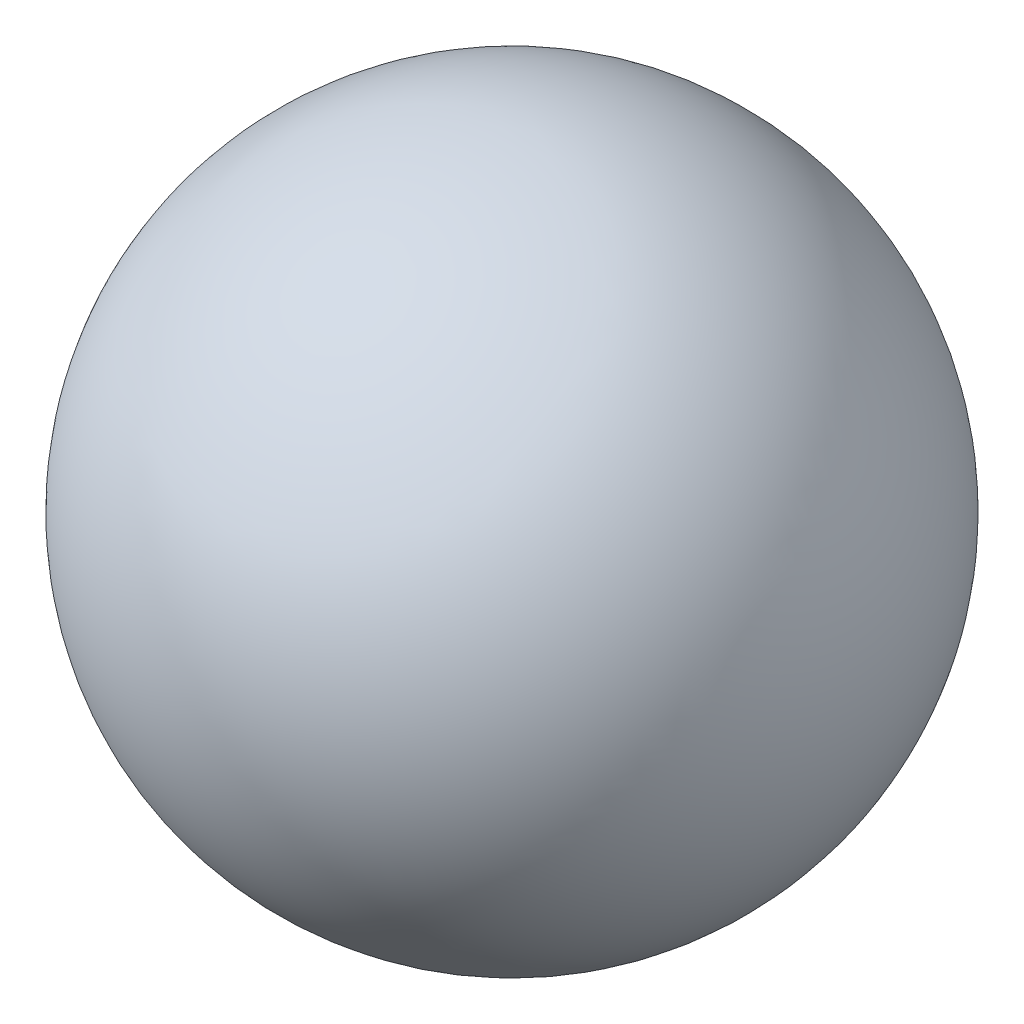
ISO-10303-21;
HEADER;
FILE_DESCRIPTION(('STEP AP214'),'2;1');
FILE_NAME('part.step','',(''),(''),'','','');
FILE_SCHEMA(('AUTOMOTIVE_DESIGN { 1 0 10303 214 1 1 1 1 }'));
ENDSEC;
DATA;
#1=APPLICATION_CONTEXT('core data for automotive mechanical design processes');
#2=APPLICATION_PROTOCOL_DEFINITION('international standard','automotive_design',2000,#1);
#3=PRODUCT_CONTEXT('',#1,'mechanical');
#4=PRODUCT('Part','Part','',(#3));
#5=PRODUCT_RELATED_PRODUCT_CATEGORY('part','',(#4));
#6=PRODUCT_DEFINITION_FORMATION('','',#4);
#7=PRODUCT_DEFINITION_CONTEXT('part definition',#1,'design');
#8=PRODUCT_DEFINITION('design','',#6,#7);
#9=PRODUCT_DEFINITION_SHAPE('','',#8);
#10=(LENGTH_UNIT() NAMED_UNIT(*) SI_UNIT(.MILLI.,.METRE.));
#11=(NAMED_UNIT(*) PLANE_ANGLE_UNIT() SI_UNIT($,.RADIAN.));
#12=(NAMED_UNIT(*) SI_UNIT($,.STERADIAN.) SOLID_ANGLE_UNIT());
#13=UNCERTAINTY_MEASURE_WITH_UNIT(LENGTH_MEASURE(1.E-05),#10,'distance_accuracy_value','');
#14=(GEOMETRIC_REPRESENTATION_CONTEXT(3) GLOBAL_UNCERTAINTY_ASSIGNED_CONTEXT((#13)) GLOBAL_UNIT_ASSIGNED_CONTEXT((#10,
#11,#12)) REPRESENTATION_CONTEXT('',''));
#15=CARTESIAN_POINT('',(0.,0.,0.));
#16=DIRECTION('',(0.,0.,1.));
#17=DIRECTION('',(1.,0.,0.));
#18=AXIS2_PLACEMENT_3D('',#15,#16,#17);
#19=CARTESIAN_POINT('',(0.,0.,-12.5));
#20=DIRECTION('',(0.,0.,1.));
#21=DIRECTION('',(-1.,0.,0.));
#22=AXIS2_PLACEMENT_3D('',#19,#20,#21);
#23=SPHERICAL_SURFACE('',#22,12.5);
#24=CARTESIAN_POINT('',(0.,0.,-12.5));
#25=DIRECTION('',(1.,0.,0.));
#26=DIRECTION('',(0.,0.,-1.));
#27=AXIS2_PLACEMENT_3D('',#24,#25,#26);
#28=SPHERICAL_SURFACE('',#27,12.5);
#29=CARTESIAN_POINT('',(-12.3389626792531,0.,-12.5));
#30=DIRECTION('',(1.,0.,0.));
#31=DIRECTION('',(0.,0.,-1.));
#32=AXIS2_PLACEMENT_3D('',#29,#30,#31);
#33=CIRCLE('',#32,2.);
#34=CARTESIAN_POINT('',(-12.3389626792531,0.,-14.5));
#35=VERTEX_POINT('',#34);
#36=EDGE_CURVE('E10',#35,#35,#33,.T.);
#37=ORIENTED_EDGE('',*,*,#36,.T.);
#38=EDGE_LOOP('',(#37));
#39=FACE_BOUND('',#38,.T.);
#40=ADVANCED_FACE('F36',(#39),#28,.T.);
#41=CARTESIAN_POINT('',(-12.5,0.,-12.5));
#42=DIRECTION('',(1.,0.,0.));
#43=DIRECTION('',(0.,0.,-1.));
#44=AXIS2_PLACEMENT_3D('',#41,#42,#43);
#45=CYLINDRICAL_SURFACE('',#44,2.);
#46=CARTESIAN_POINT('',(0.,0.,-12.5));
#47=DIRECTION('',(1.,0.,0.));
#48=DIRECTION('',(0.,0.,-1.));
#49=AXIS2_PLACEMENT_3D('',#46,#47,#48);
#50=CIRCLE('',#49,2.);
#51=CARTESIAN_POINT('',(0.,0.,-14.5));
#52=VERTEX_POINT('',#51);
#53=EDGE_CURVE('E42',#52,#52,#50,.T.);
#54=ORIENTED_EDGE('',*,*,#53,.T.);
#55=EDGE_LOOP('',(#54));
#56=FACE_BOUND('',#55,.T.);
#57=ORIENTED_EDGE('',*,*,#36,.F.);
#58=EDGE_LOOP('',(#57));
#59=FACE_BOUND('',#58,.T.);
#60=ADVANCED_FACE('F48',(#56,#59),#45,.F.);
#61=CARTESIAN_POINT('',(0.,0.,-12.5));
#62=DIRECTION('',(1.,0.,0.));
#63=DIRECTION('',(0.,0.,-1.));
#64=AXIS2_PLACEMENT_3D('',#61,#62,#63);
#65=PLANE('',#64);
#66=ORIENTED_EDGE('',*,*,#53,.F.);
#67=EDGE_LOOP('',(#66));
#68=FACE_BOUND('',#67,.T.);
#69=ADVANCED_FACE('F51',(#68),#65,.F.);
#70=CLOSED_SHELL('',(#40,#60,#69));
#71=MANIFOLD_SOLID_BREP('B2',#70);
#72=ADVANCED_BREP_SHAPE_REPRESENTATION('',(#18,#71),#14);
#73=SHAPE_DEFINITION_REPRESENTATION(#9,#72);
ENDSEC;
END-ISO-10303-21;
